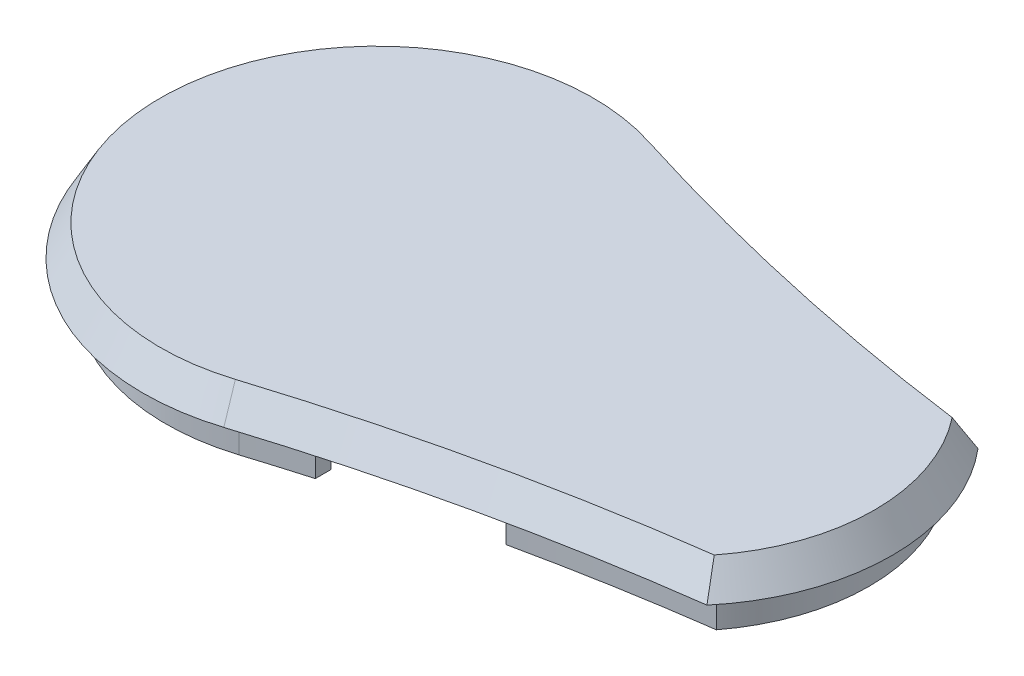
ISO-10303-21;
HEADER;
FILE_DESCRIPTION(('STEP AP214'),'2;1');
FILE_NAME('part.step','',(''),(''),'','','');
FILE_SCHEMA(('AUTOMOTIVE_DESIGN { 1 0 10303 214 1 1 1 1 }'));
ENDSEC;
DATA;
#1=APPLICATION_CONTEXT('core data for automotive mechanical design processes');
#2=APPLICATION_PROTOCOL_DEFINITION('international standard','automotive_design',2000,#1);
#3=PRODUCT_CONTEXT('',#1,'mechanical');
#4=PRODUCT('Part','Part','',(#3));
#5=PRODUCT_RELATED_PRODUCT_CATEGORY('part','',(#4));
#6=PRODUCT_DEFINITION_FORMATION('','',#4);
#7=PRODUCT_DEFINITION_CONTEXT('part definition',#1,'design');
#8=PRODUCT_DEFINITION('design','',#6,#7);
#9=PRODUCT_DEFINITION_SHAPE('','',#8);
#10=(LENGTH_UNIT() NAMED_UNIT(*) SI_UNIT(.MILLI.,.METRE.));
#11=(NAMED_UNIT(*) PLANE_ANGLE_UNIT() SI_UNIT($,.RADIAN.));
#12=(NAMED_UNIT(*) SI_UNIT($,.STERADIAN.) SOLID_ANGLE_UNIT());
#13=UNCERTAINTY_MEASURE_WITH_UNIT(LENGTH_MEASURE(1.E-05),#10,'distance_accuracy_value','');
#14=(GEOMETRIC_REPRESENTATION_CONTEXT(3) GLOBAL_UNCERTAINTY_ASSIGNED_CONTEXT((#13)) GLOBAL_UNIT_ASSIGNED_CONTEXT((#10,
#11,#12)) REPRESENTATION_CONTEXT('',''));
#15=CARTESIAN_POINT('',(0.,0.,0.));
#16=DIRECTION('',(0.,0.,1.));
#17=DIRECTION('',(1.,0.,0.));
#18=AXIS2_PLACEMENT_3D('',#15,#16,#17);
#19=CARTESIAN_POINT('',(101.133333333333,-5.,321.467026130035));
#20=DIRECTION('',(0.,-1.,0.));
#21=DIRECTION('',(0.,0.,-1.));
#22=AXIS2_PLACEMENT_3D('',#19,#20,#21);
#23=PLANE('',#22);
#24=DIRECTION('',(0.,0.,-1.));
#25=VECTOR('',#24,1.);
#26=CARTESIAN_POINT('',(16.,-5.,32.5));
#27=LINE('',#26,#25);
#28=CARTESIAN_POINT('',(16.,-5.,24.0611321344608));
#29=VERTEX_POINT('',#28);
#30=CARTESIAN_POINT('',(16.,-5.,21.9813516894183));
#31=VERTEX_POINT('',#30);
#32=EDGE_CURVE('E47',#29,#31,#27,.T.);
#33=ORIENTED_EDGE('',*,*,#32,.F.);
#34=CARTESIAN_POINT('',(101.133333333333,-5.,321.467026130035));
#35=DIRECTION('',(0.,1.,0.));
#36=DIRECTION('',(0.,0.,-1.));
#37=AXIS2_PLACEMENT_3D('',#34,#35,#36);
#38=CIRCLE('',#37,309.350852961086);
#39=CARTESIAN_POINT('',(8.29747894323103,-5.,26.3747450256135));
#40=VERTEX_POINT('',#39);
#41=EDGE_CURVE('E226',#29,#40,#38,.T.);
#42=ORIENTED_EDGE('',*,*,#41,.T.);
#43=CARTESIAN_POINT('',(0.,-5.,0.));
#44=DIRECTION('',(0.,-1.,0.));
#45=DIRECTION('',(0.,0.,-1.));
#46=AXIS2_PLACEMENT_3D('',#43,#44,#45);
#47=CIRCLE('',#46,27.649147038914);
#48=CARTESIAN_POINT('',(8.29747894323073,-5.,-26.3747450256136));
#49=VERTEX_POINT('',#48);
#50=EDGE_CURVE('E237',#40,#49,#47,.T.);
#51=ORIENTED_EDGE('',*,*,#50,.T.);
#52=CARTESIAN_POINT('',(101.133333333333,-5.,-321.467026130035));
#53=DIRECTION('',(0.,1.,0.));
#54=DIRECTION('',(0.,0.,-1.));
#55=AXIS2_PLACEMENT_3D('',#52,#53,#54);
#56=CIRCLE('',#55,309.350852961086);
#57=CARTESIAN_POINT('',(16.,-5.,-24.0611321344607));
#58=VERTEX_POINT('',#57);
#59=EDGE_CURVE('E240',#49,#58,#56,.T.);
#60=ORIENTED_EDGE('',*,*,#59,.T.);
#61=CARTESIAN_POINT('',(16.,-5.,-21.9813516894182));
#62=VERTEX_POINT('',#61);
#63=EDGE_CURVE('E231',#62,#58,#27,.T.);
#64=ORIENTED_EDGE('',*,*,#63,.F.);
#65=CARTESIAN_POINT('',(101.133333333333,-5.,-321.467026130035));
#66=DIRECTION('',(0.,1.,0.));
#67=DIRECTION('',(0.,0.,-1.));
#68=AXIS2_PLACEMENT_3D('',#65,#66,#67);
#69=CIRCLE('',#68,311.350852961086);
#70=CARTESIAN_POINT('',(7.6972811192941,-5.,-24.4669288468002));
#71=VERTEX_POINT('',#70);
#72=EDGE_CURVE('E426',#71,#62,#69,.T.);
#73=ORIENTED_EDGE('',*,*,#72,.F.);
#74=CARTESIAN_POINT('',(0.,-5.,0.));
#75=DIRECTION('',(0.,-1.,0.));
#76=DIRECTION('',(0.,0.,-1.));
#77=AXIS2_PLACEMENT_3D('',#74,#75,#76);
#78=CIRCLE('',#77,25.649147038914);
#79=CARTESIAN_POINT('',(7.69728111929433,-5.,24.4669288468002));
#80=VERTEX_POINT('',#79);
#81=EDGE_CURVE('E424',#80,#71,#78,.T.);
#82=ORIENTED_EDGE('',*,*,#81,.F.);
#83=CARTESIAN_POINT('',(101.133333333333,-5.,321.467026130035));
#84=DIRECTION('',(0.,1.,0.));
#85=DIRECTION('',(0.,0.,-1.));
#86=AXIS2_PLACEMENT_3D('',#83,#84,#85);
#87=CIRCLE('',#86,311.350852961086);
#88=EDGE_CURVE('E229',#31,#80,#87,.T.);
#89=ORIENTED_EDGE('',*,*,#88,.F.);
#90=EDGE_LOOP('',(#33,#42,#51,#60,#64,#73,#82,#89));
#91=FACE_BOUND('',#90,.T.);
#92=ADVANCED_FACE('F32',(#91),#23,.T.);
#93=CARTESIAN_POINT('',(70.5666666666667,0.,-160.733513065018));
#94=DIRECTION('',(0.,1.,0.));
#95=DIRECTION('',(0.,0.,1.));
#96=AXIS2_PLACEMENT_3D('',#93,#94,#95);
#97=PLANE('',#96);
#98=DIRECTION('',(0.,0.,-1.));
#99=VECTOR('',#98,1.);
#100=CARTESIAN_POINT('',(16.,0.,32.5));
#101=LINE('',#100,#99);
#102=CARTESIAN_POINT('',(16.,0.,-21.9813516894182));
#103=VERTEX_POINT('',#102);
#104=CARTESIAN_POINT('',(16.,0.,-24.0611321344607));
#105=VERTEX_POINT('',#104);
#106=EDGE_CURVE('E355',#103,#105,#101,.T.);
#107=ORIENTED_EDGE('',*,*,#106,.T.);
#108=CARTESIAN_POINT('',(101.133333333333,0.,-321.467026130035));
#109=DIRECTION('',(0.,1.,0.));
#110=DIRECTION('',(0.,0.,-1.));
#111=AXIS2_PLACEMENT_3D('',#108,#109,#110);
#112=CIRCLE('',#111,309.350852961086);
#113=CARTESIAN_POINT('',(8.29747894323073,0.,-26.3747450256136));
#114=VERTEX_POINT('',#113);
#115=EDGE_CURVE('E264',#114,#105,#112,.T.);
#116=ORIENTED_EDGE('',*,*,#115,.F.);
#117=CARTESIAN_POINT('',(0.,0.,0.));
#118=DIRECTION('',(0.,-1.,0.));
#119=DIRECTION('',(0.,0.,-1.));
#120=AXIS2_PLACEMENT_3D('',#117,#118,#119);
#121=CIRCLE('',#120,27.649147038914);
#122=CARTESIAN_POINT('',(8.29747894323103,0.,26.3747450256135));
#123=VERTEX_POINT('',#122);
#124=EDGE_CURVE('E261',#123,#114,#121,.T.);
#125=ORIENTED_EDGE('',*,*,#124,.F.);
#126=CARTESIAN_POINT('',(101.133333333333,0.,321.467026130035));
#127=DIRECTION('',(0.,1.,0.));
#128=DIRECTION('',(0.,0.,-1.));
#129=AXIS2_PLACEMENT_3D('',#126,#127,#128);
#130=CIRCLE('',#129,309.350852961086);
#131=CARTESIAN_POINT('',(16.,0.,24.0611321344608));
#132=VERTEX_POINT('',#131);
#133=EDGE_CURVE('E259',#132,#123,#130,.T.);
#134=ORIENTED_EDGE('',*,*,#133,.F.);
#135=CARTESIAN_POINT('',(16.,0.,21.9813516894183));
#136=VERTEX_POINT('',#135);
#137=EDGE_CURVE('E217',#132,#136,#101,.T.);
#138=ORIENTED_EDGE('',*,*,#137,.T.);
#139=CARTESIAN_POINT('',(101.133333333333,0.,321.467026130035));
#140=DIRECTION('',(0.,1.,0.));
#141=DIRECTION('',(0.,0.,1.));
#142=AXIS2_PLACEMENT_3D('',#139,#140,#141);
#143=CIRCLE('',#142,311.350852961086);
#144=CARTESIAN_POINT('',(23.3066939615326,0.,20.));
#145=VERTEX_POINT('',#144);
#146=EDGE_CURVE('E686',#136,#145,#143,.F.);
#147=ORIENTED_EDGE('',*,*,#146,.T.);
#148=DIRECTION('',(1.,0.,0.));
#149=VECTOR('',#148,1.);
#150=CARTESIAN_POINT('',(23.3066939615326,0.,20.));
#151=LINE('',#150,#149);
#152=CARTESIAN_POINT('',(27.8689571226325,0.,20.));
#153=VERTEX_POINT('',#152);
#154=EDGE_CURVE('E685',#145,#153,#151,.T.);
#155=ORIENTED_EDGE('',*,*,#154,.T.);
#156=CARTESIAN_POINT('',(27.8689571226325,0.,17.));
#157=DIRECTION('',(0.,1.,0.));
#158=DIRECTION('',(0.,0.,1.));
#159=AXIS2_PLACEMENT_3D('',#156,#157,#158);
#160=CIRCLE('',#159,3.);
#161=CARTESIAN_POINT('',(29.9902774661921,0.,19.1213203435596));
#162=VERTEX_POINT('',#161);
#163=EDGE_CURVE('E690',#153,#162,#160,.T.);
#164=ORIENTED_EDGE('',*,*,#163,.T.);
#165=DIRECTION('',(0.707106781186568,0.,-0.707106781186527));
#166=VECTOR('',#165,1.);
#167=CARTESIAN_POINT('',(29.9902774661921,0.,19.1213203435596));
#168=LINE('',#167,#166);
#169=CARTESIAN_POINT('',(30.9917528563012,0.,18.1198449534506));
#170=VERTEX_POINT('',#169);
#171=EDGE_CURVE('E697',#162,#170,#168,.T.);
#172=ORIENTED_EDGE('',*,*,#171,.T.);
#173=CARTESIAN_POINT('',(101.133333333333,0.,321.467026130035));
#174=DIRECTION('',(0.,1.,0.));
#175=DIRECTION('',(0.,0.,1.));
#176=AXIS2_PLACEMENT_3D('',#173,#174,#175);
#177=CIRCLE('',#176,311.350852961086);
#178=CARTESIAN_POINT('',(36.,0.,17.0052017111361));
#179=VERTEX_POINT('',#178);
#180=EDGE_CURVE('E699',#170,#179,#177,.F.);
#181=ORIENTED_EDGE('',*,*,#180,.T.);
#182=DIRECTION('',(0.,0.,1.));
#183=VECTOR('',#182,1.);
#184=CARTESIAN_POINT('',(36.,0.,32.5));
#185=LINE('',#184,#183);
#186=CARTESIAN_POINT('',(36.,0.,19.0507581869231));
#187=VERTEX_POINT('',#186);
#188=EDGE_CURVE('E702',#179,#187,#185,.T.);
#189=ORIENTED_EDGE('',*,*,#188,.T.);
#190=CARTESIAN_POINT('',(101.133333333333,0.,321.467026130035));
#191=DIRECTION('',(0.,1.,0.));
#192=DIRECTION('',(0.,0.,-1.));
#193=AXIS2_PLACEMENT_3D('',#190,#191,#192);
#194=CIRCLE('',#193,309.350852961086);
#195=CARTESIAN_POINT('',(59.4237727680008,0.,14.940905244395));
#196=VERTEX_POINT('',#195);
#197=EDGE_CURVE('E238',#196,#187,#194,.T.);
#198=ORIENTED_EDGE('',*,*,#197,.F.);
#199=CARTESIAN_POINT('',(40.,0.,0.));
#200=DIRECTION('',(0.,-1.,0.));
#201=DIRECTION('',(0.,0.,-1.));
#202=AXIS2_PLACEMENT_3D('',#199,#200,#201);
#203=CIRCLE('',#202,24.5053789618712);
#204=CARTESIAN_POINT('',(59.423772768001,0.,-14.9409052443948));
#205=VERTEX_POINT('',#204);
#206=EDGE_CURVE('E243',#205,#196,#203,.T.);
#207=ORIENTED_EDGE('',*,*,#206,.F.);
#208=CARTESIAN_POINT('',(101.133333333333,0.,-321.467026130035));
#209=DIRECTION('',(0.,1.,0.));
#210=DIRECTION('',(0.,0.,-1.));
#211=AXIS2_PLACEMENT_3D('',#208,#209,#210);
#212=CIRCLE('',#211,309.350852961086);
#213=CARTESIAN_POINT('',(36.,0.,-19.0507581869231));
#214=VERTEX_POINT('',#213);
#215=EDGE_CURVE('E267',#214,#205,#212,.T.);
#216=ORIENTED_EDGE('',*,*,#215,.F.);
#217=CARTESIAN_POINT('',(36.,0.,-17.0052017111361));
#218=VERTEX_POINT('',#217);
#219=EDGE_CURVE('E704',#214,#218,#185,.T.);
#220=ORIENTED_EDGE('',*,*,#219,.T.);
#221=CARTESIAN_POINT('',(101.133333333333,0.,-321.467026130035));
#222=DIRECTION('',(0.,1.,0.));
#223=DIRECTION('',(0.,0.,1.));
#224=AXIS2_PLACEMENT_3D('',#221,#222,#223);
#225=CIRCLE('',#224,311.350852961086);
#226=CARTESIAN_POINT('',(30.9917528563011,0.,-18.1198449534506));
#227=VERTEX_POINT('',#226);
#228=EDGE_CURVE('E688',#218,#227,#225,.F.);
#229=ORIENTED_EDGE('',*,*,#228,.T.);
#230=DIRECTION('',(-0.707106781186508,0.,-0.707106781186587));
#231=VECTOR('',#230,1.);
#232=CARTESIAN_POINT('',(30.9917528563011,0.,-18.1198449534506));
#233=LINE('',#232,#231);
#234=CARTESIAN_POINT('',(29.9902774661921,0.,-19.1213203435596));
#235=VERTEX_POINT('',#234);
#236=EDGE_CURVE('E692',#227,#235,#233,.T.);
#237=ORIENTED_EDGE('',*,*,#236,.T.);
#238=CARTESIAN_POINT('',(27.8689571226325,0.,-17.));
#239=DIRECTION('',(0.,1.,0.));
#240=DIRECTION('',(0.,0.,1.));
#241=AXIS2_PLACEMENT_3D('',#238,#239,#240);
#242=CIRCLE('',#241,3.);
#243=CARTESIAN_POINT('',(27.8689571226325,0.,-20.));
#244=VERTEX_POINT('',#243);
#245=EDGE_CURVE('E55',#235,#244,#242,.T.);
#246=ORIENTED_EDGE('',*,*,#245,.T.);
#247=DIRECTION('',(-1.,0.,0.));
#248=VECTOR('',#247,1.);
#249=CARTESIAN_POINT('',(27.8689571226325,0.,-20.));
#250=LINE('',#249,#248);
#251=CARTESIAN_POINT('',(23.3066939615324,0.,-20.));
#252=VERTEX_POINT('',#251);
#253=EDGE_CURVE('E292',#244,#252,#250,.T.);
#254=ORIENTED_EDGE('',*,*,#253,.T.);
#255=CARTESIAN_POINT('',(101.133333333333,0.,-321.467026130035));
#256=DIRECTION('',(0.,1.,0.));
#257=DIRECTION('',(0.,0.,1.));
#258=AXIS2_PLACEMENT_3D('',#255,#256,#257);
#259=CIRCLE('',#258,311.350852961086);
#260=EDGE_CURVE('E707',#252,#103,#259,.F.);
#261=ORIENTED_EDGE('',*,*,#260,.T.);
#262=EDGE_LOOP('',(#107,#116,#125,#134,#138,#147,#155,#164,#172,#181,#189,#198,#207,#216,#220,
#229,#237,#246,#254,#261));
#263=FACE_BOUND('',#262,.T.);
#264=CARTESIAN_POINT('',(40.,0.,0.));
#265=DIRECTION('',(0.,1.,0.));
#266=DIRECTION('',(0.,0.,1.));
#267=AXIS2_PLACEMENT_3D('',#264,#265,#266);
#268=CIRCLE('',#267,27.505378961871);
#269=CARTESIAN_POINT('',(61.0068895309128,0.,17.755462936014));
#270=VERTEX_POINT('',#269);
#271=CARTESIAN_POINT('',(61.0068895309128,0.,-17.755462936014));
#272=VERTEX_POINT('',#271);
#273=EDGE_CURVE('E286',#270,#272,#268,.T.);
#274=ORIENTED_EDGE('',*,*,#273,.F.);
#275=CARTESIAN_POINT('',(101.133333333333,0.,321.467026130035));
#276=DIRECTION('',(0.,-1.,0.));
#277=DIRECTION('',(0.,0.,1.));
#278=AXIS2_PLACEMENT_3D('',#275,#276,#277);
#279=CIRCLE('',#278,306.350852961086);
#280=CARTESIAN_POINT('',(9.19777567913612,0.,29.2364692938334));
#281=VERTEX_POINT('',#280);
#282=EDGE_CURVE('E284',#281,#270,#279,.T.);
#283=ORIENTED_EDGE('',*,*,#282,.F.);
#284=CARTESIAN_POINT('',(0.,0.,0.));
#285=DIRECTION('',(0.,1.,0.));
#286=DIRECTION('',(0.,0.,1.));
#287=AXIS2_PLACEMENT_3D('',#284,#285,#286);
#288=CIRCLE('',#287,30.649147038914);
#289=CARTESIAN_POINT('',(9.19777567913601,0.,-29.2364692938335));
#290=VERTEX_POINT('',#289);
#291=EDGE_CURVE('E282',#290,#281,#288,.T.);
#292=ORIENTED_EDGE('',*,*,#291,.F.);
#293=CARTESIAN_POINT('',(101.133333333333,0.,-321.467026130035));
#294=DIRECTION('',(0.,-1.,0.));
#295=DIRECTION('',(0.,0.,1.));
#296=AXIS2_PLACEMENT_3D('',#293,#294,#295);
#297=CIRCLE('',#296,306.350852961086);
#298=EDGE_CURVE('E280',#272,#290,#297,.T.);
#299=ORIENTED_EDGE('',*,*,#298,.F.);
#300=EDGE_LOOP('',(#274,#283,#292,#299));
#301=FACE_BOUND('',#300,.T.);
#302=ADVANCED_FACE('F328',(#263,#301),#97,.F.);
#303=CARTESIAN_POINT('',(101.133333333333,0.,-321.467026130035));
#304=DIRECTION('',(0.,1.,0.));
#305=DIRECTION('',(0.,0.,1.));
#306=AXIS2_PLACEMENT_3D('',#303,#304,#305);
#307=CONICAL_SURFACE('',#306,306.350852961086,0.5235987755983);
#308=ORIENTED_EDGE('',*,*,#298,.T.);
#309=DIRECTION('',(0.150049455984174,-0.866025403784438,-0.476954044703318));
#310=VECTOR('',#309,1.);
#311=CARTESIAN_POINT('',(9.197775679136,0.,-29.2364692938335));
#312=LINE('',#311,#310);
#313=CARTESIAN_POINT('',(8.50472692870224,4.,-27.0335129250291));
#314=VERTEX_POINT('',#313);
#315=EDGE_CURVE('E289',#314,#290,#312,.T.);
#316=ORIENTED_EDGE('',*,*,#315,.F.);
#317=CARTESIAN_POINT('',(101.133333333333,4.,-321.467026130035));
#318=DIRECTION('',(0.,1.,0.));
#319=DIRECTION('',(0.,0.,1.));
#320=AXIS2_PLACEMENT_3D('',#317,#318,#319);
#321=CIRCLE('',#320,308.660254037844);
#322=CARTESIAN_POINT('',(59.7957246323996,4.,-15.5873855365576));
#323=VERTEX_POINT('',#322);
#324=EDGE_CURVE('E288',#323,#314,#321,.F.);
#325=ORIENTED_EDGE('',*,*,#324,.F.);
#326=CARTESIAN_POINT('',(59.7957246323996,4.,-15.5873855365576));
#327=CARTESIAN_POINT('',(59.8986271619901,3.66696589832843,-15.767504195531));
#328=CARTESIAN_POINT('',(60.0010149966196,3.33385177066652,-15.9477687176377));
#329=CARTESIAN_POINT('',(60.2047935761917,2.66747314652459,-16.3085775395495));
#330=CARTESIAN_POINT('',(60.3061843277656,2.33420865106005,-16.4891218374847));
#331=CARTESIAN_POINT('',(60.5080023443883,1.66753475904859,-16.8504805422827));
#332=CARTESIAN_POINT('',(60.6084296100658,1.33412536259638,-17.0312949489692));
#333=CARTESIAN_POINT('',(60.8083515994204,0.667165931540273,-17.3931854304988));
#334=CARTESIAN_POINT('',(60.907846316887,0.333615896015199,-17.5742615070753));
#335=CARTESIAN_POINT('',(61.0068895309128,0.,-17.755462936014));
#336=B_SPLINE_CURVE_WITH_KNOTS('',3,(#326,#327,#328,#329,#330,#331,#332,#333,#334,#335),
.UNSPECIFIED.,.F.,.F.,(4,2,2,2,4),(0.,1.17706803318524,2.35412823278435,3.53118766411995,
4.70825492873395),.UNSPECIFIED.);
#337=EDGE_CURVE('E294',#323,#272,#336,.T.);
#338=ORIENTED_EDGE('',*,*,#337,.T.);
#339=EDGE_LOOP('',(#308,#316,#325,#338));
#340=FACE_BOUND('',#339,.T.);
#341=ADVANCED_FACE('F310',(#340),#307,.F.);
#342=CARTESIAN_POINT('',(0.,0.,0.));
#343=DIRECTION('',(0.,-1.,0.));
#344=DIRECTION('',(0.,0.,1.));
#345=AXIS2_PLACEMENT_3D('',#342,#343,#344);
#346=CONICAL_SURFACE('',#345,30.649147038914,0.5235987755983);
#347=ORIENTED_EDGE('',*,*,#291,.T.);
#348=DIRECTION('',(0.150049455984174,-0.866025403784438,0.476954044703318));
#349=VECTOR('',#348,1.);
#350=CARTESIAN_POINT('',(9.19777567913624,0.,29.2364692938334));
#351=LINE('',#350,#349);
#352=CARTESIAN_POINT('',(8.50472692870248,4.,27.0335129250291));
#353=VERTEX_POINT('',#352);
#354=EDGE_CURVE('E293',#353,#281,#351,.T.);
#355=ORIENTED_EDGE('',*,*,#354,.F.);
#356=CARTESIAN_POINT('',(0.,4.,0.));
#357=DIRECTION('',(0.,1.,0.));
#358=DIRECTION('',(0.,0.,1.));
#359=AXIS2_PLACEMENT_3D('',#356,#357,#358);
#360=CIRCLE('',#359,28.3397459621555);
#361=EDGE_CURVE('E473',#314,#353,#360,.T.);
#362=ORIENTED_EDGE('',*,*,#361,.F.);
#363=ORIENTED_EDGE('',*,*,#315,.T.);
#364=EDGE_LOOP('',(#347,#355,#362,#363));
#365=FACE_BOUND('',#364,.T.);
#366=ADVANCED_FACE('F34',(#365),#346,.T.);
#367=CARTESIAN_POINT('',(101.133333333333,0.,321.467026130035));
#368=DIRECTION('',(0.,1.,0.));
#369=DIRECTION('',(0.,0.,1.));
#370=AXIS2_PLACEMENT_3D('',#367,#368,#369);
#371=CONICAL_SURFACE('',#370,306.350852961086,0.5235987755983);
#372=ORIENTED_EDGE('',*,*,#282,.T.);
#373=CARTESIAN_POINT('',(59.7957246323997,4.,15.5873855365576));
#374=CARTESIAN_POINT('',(59.89862716199,3.66696589832844,15.7675041955311));
#375=CARTESIAN_POINT('',(60.0010149966195,3.33385177066653,15.9477687176378));
#376=CARTESIAN_POINT('',(60.2047935761917,2.6674731465246,16.3085775395496));
#377=CARTESIAN_POINT('',(60.3061843277656,2.33420865106005,16.4891218374847));
#378=CARTESIAN_POINT('',(60.5080023443883,1.66753475904858,16.8504805422827));
#379=CARTESIAN_POINT('',(60.6084296100658,1.33412536259637,17.0312949489692));
#380=CARTESIAN_POINT('',(60.8083515994203,0.667165931540267,17.3931854304988));
#381=CARTESIAN_POINT('',(60.9078463168869,0.333615896015193,17.5742615070753));
#382=CARTESIAN_POINT('',(61.0068895309128,0.,17.755462936014));
#383=B_SPLINE_CURVE_WITH_KNOTS('',3,(#373,#374,#375,#376,#377,#378,#379,#380,#381,#382),
.UNSPECIFIED.,.F.,.F.,(4,2,2,2,4),(0.,1.17706803318525,2.35412823278437,3.53118766411997,
4.70825492873397),.UNSPECIFIED.);
#384=CARTESIAN_POINT('',(59.7957246323997,4.,15.5873855365576));
#385=VERTEX_POINT('',#384);
#386=EDGE_CURVE('E303',#385,#270,#383,.T.);
#387=ORIENTED_EDGE('',*,*,#386,.F.);
#388=CARTESIAN_POINT('',(101.133333333333,4.,321.467026130035));
#389=DIRECTION('',(0.,1.,0.));
#390=DIRECTION('',(0.,0.,1.));
#391=AXIS2_PLACEMENT_3D('',#388,#389,#390);
#392=CIRCLE('',#391,308.660254037845);
#393=EDGE_CURVE('E471',#353,#385,#392,.F.);
#394=ORIENTED_EDGE('',*,*,#393,.F.);
#395=ORIENTED_EDGE('',*,*,#354,.T.);
#396=EDGE_LOOP('',(#372,#387,#394,#395));
#397=FACE_BOUND('',#396,.T.);
#398=ADVANCED_FACE('F317',(#397),#371,.F.);
#399=CARTESIAN_POINT('',(40.,0.,0.));
#400=DIRECTION('',(0.,-1.,0.));
#401=DIRECTION('',(0.,0.,1.));
#402=AXIS2_PLACEMENT_3D('',#399,#400,#401);
#403=CONICAL_SURFACE('',#402,27.505378961871,0.5235987755983);
#404=ORIENTED_EDGE('',*,*,#273,.T.);
#405=ORIENTED_EDGE('',*,*,#337,.F.);
#406=CARTESIAN_POINT('',(40.,4.,0.));
#407=DIRECTION('',(0.,1.,0.));
#408=DIRECTION('',(0.,0.,1.));
#409=AXIS2_PLACEMENT_3D('',#406,#407,#408);
#410=CIRCLE('',#409,25.1959778851125);
#411=EDGE_CURVE('E304',#385,#323,#410,.T.);
#412=ORIENTED_EDGE('',*,*,#411,.F.);
#413=ORIENTED_EDGE('',*,*,#386,.T.);
#414=EDGE_LOOP('',(#404,#405,#412,#413));
#415=FACE_BOUND('',#414,.T.);
#416=ADVANCED_FACE('F313',(#415),#403,.T.);
#417=CARTESIAN_POINT('',(70.5666666666667,4.,-160.733513065018));
#418=DIRECTION('',(0.,1.,0.));
#419=DIRECTION('',(0.,0.,1.));
#420=AXIS2_PLACEMENT_3D('',#417,#418,#419);
#421=PLANE('',#420);
#422=ORIENTED_EDGE('',*,*,#324,.T.);
#423=ORIENTED_EDGE('',*,*,#361,.T.);
#424=ORIENTED_EDGE('',*,*,#393,.T.);
#425=ORIENTED_EDGE('',*,*,#411,.T.);
#426=EDGE_LOOP('',(#422,#423,#424,#425));
#427=FACE_BOUND('',#426,.T.);
#428=ADVANCED_FACE('F316',(#427),#421,.T.);
#429=DIRECTION('',(0.,0.,1.));
#430=VECTOR('',#429,1.);
#431=CARTESIAN_POINT('',(36.,-5.,32.5));
#432=LINE('',#431,#430);
#433=CARTESIAN_POINT('',(36.,-5.,-19.0507581869231));
#434=VERTEX_POINT('',#433);
#435=CARTESIAN_POINT('',(36.,-5.,-17.0052017111361));
#436=VERTEX_POINT('',#435);
#437=EDGE_CURVE('E348',#434,#436,#432,.T.);
#438=ORIENTED_EDGE('',*,*,#437,.F.);
#439=CARTESIAN_POINT('',(101.133333333333,-5.,-321.467026130035));
#440=DIRECTION('',(0.,1.,0.));
#441=DIRECTION('',(0.,0.,-1.));
#442=AXIS2_PLACEMENT_3D('',#439,#440,#441);
#443=CIRCLE('',#442,309.350852961086);
#444=CARTESIAN_POINT('',(59.4237727680011,-5.,-14.9409052443949));
#445=VERTEX_POINT('',#444);
#446=EDGE_CURVE('E251',#434,#445,#443,.T.);
#447=ORIENTED_EDGE('',*,*,#446,.T.);
#448=CARTESIAN_POINT('',(40.,-5.,0.));
#449=DIRECTION('',(0.,-1.,0.));
#450=DIRECTION('',(0.,0.,-1.));
#451=AXIS2_PLACEMENT_3D('',#448,#449,#450);
#452=CIRCLE('',#451,24.5053789618712);
#453=CARTESIAN_POINT('',(59.4237727680008,-5.,14.940905244395));
#454=VERTEX_POINT('',#453);
#455=EDGE_CURVE('E253',#445,#454,#452,.T.);
#456=ORIENTED_EDGE('',*,*,#455,.T.);
#457=CARTESIAN_POINT('',(101.133333333333,-5.,321.467026130035));
#458=DIRECTION('',(0.,1.,0.));
#459=DIRECTION('',(0.,0.,-1.));
#460=AXIS2_PLACEMENT_3D('',#457,#458,#459);
#461=CIRCLE('',#460,309.350852961086);
#462=CARTESIAN_POINT('',(36.,-5.,19.0507581869231));
#463=VERTEX_POINT('',#462);
#464=EDGE_CURVE('E255',#454,#463,#461,.T.);
#465=ORIENTED_EDGE('',*,*,#464,.T.);
#466=CARTESIAN_POINT('',(36.,-5.,17.0052017111361));
#467=VERTEX_POINT('',#466);
#468=EDGE_CURVE('E230',#467,#463,#432,.T.);
#469=ORIENTED_EDGE('',*,*,#468,.F.);
#470=CARTESIAN_POINT('',(101.133333333333,-5.,321.467026130035));
#471=DIRECTION('',(0.,1.,0.));
#472=DIRECTION('',(0.,0.,-1.));
#473=AXIS2_PLACEMENT_3D('',#470,#471,#472);
#474=CIRCLE('',#473,311.350852961086);
#475=CARTESIAN_POINT('',(58.3183343717941,-5.,13.0740471186462));
#476=VERTEX_POINT('',#475);
#477=EDGE_CURVE('E421',#476,#467,#474,.T.);
#478=ORIENTED_EDGE('',*,*,#477,.F.);
#479=CARTESIAN_POINT('',(40.,-5.,0.));
#480=DIRECTION('',(0.,-1.,0.));
#481=DIRECTION('',(0.,0.,-1.));
#482=AXIS2_PLACEMENT_3D('',#479,#480,#481);
#483=CIRCLE('',#482,22.5053789618713);
#484=CARTESIAN_POINT('',(58.3183343717943,-5.,-13.0740471186461));
#485=VERTEX_POINT('',#484);
#486=EDGE_CURVE('E419',#485,#476,#483,.T.);
#487=ORIENTED_EDGE('',*,*,#486,.F.);
#488=CARTESIAN_POINT('',(101.133333333333,-5.,-321.467026130035));
#489=DIRECTION('',(0.,1.,0.));
#490=DIRECTION('',(0.,0.,-1.));
#491=AXIS2_PLACEMENT_3D('',#488,#489,#490);
#492=CIRCLE('',#491,311.350852961086);
#493=EDGE_CURVE('E352',#436,#485,#492,.T.);
#494=ORIENTED_EDGE('',*,*,#493,.F.);
#495=EDGE_LOOP('',(#438,#447,#456,#465,#469,#478,#487,#494));
#496=FACE_BOUND('',#495,.T.);
#497=ADVANCED_FACE('F330',(#496),#23,.T.);
#498=CARTESIAN_POINT('',(101.133333333333,-5.,321.467026130035));
#499=DIRECTION('',(0.,1.,0.));
#500=DIRECTION('',(0.,0.,1.));
#501=AXIS2_PLACEMENT_3D('',#498,#499,#500);
#502=CYLINDRICAL_SURFACE('',#501,309.350852961086);
#503=ORIENTED_EDGE('',*,*,#41,.F.);
#504=DIRECTION('',(0.,1.,0.));
#505=VECTOR('',#504,1.);
#506=CARTESIAN_POINT('',(16.,-5.,24.0611321344608));
#507=LINE('',#506,#505);
#508=EDGE_CURVE('E214',#29,#132,#507,.T.);
#509=ORIENTED_EDGE('',*,*,#508,.T.);
#510=ORIENTED_EDGE('',*,*,#133,.T.);
#511=DIRECTION('',(0.,1.,0.));
#512=VECTOR('',#511,1.);
#513=CARTESIAN_POINT('',(8.29747894323103,-5.,26.3747450256135));
#514=LINE('',#513,#512);
#515=EDGE_CURVE('E236',#40,#123,#514,.T.);
#516=ORIENTED_EDGE('',*,*,#515,.F.);
#517=EDGE_LOOP('',(#503,#509,#510,#516));
#518=FACE_BOUND('',#517,.T.);
#519=ADVANCED_FACE('F234',(#518),#502,.F.);
#520=CARTESIAN_POINT('',(0.,-5.,0.));
#521=DIRECTION('',(0.,1.,0.));
#522=DIRECTION('',(0.,0.,1.));
#523=AXIS2_PLACEMENT_3D('',#520,#521,#522);
#524=CYLINDRICAL_SURFACE('',#523,27.649147038914);
#525=ORIENTED_EDGE('',*,*,#124,.T.);
#526=DIRECTION('',(0.,1.,0.));
#527=VECTOR('',#526,1.);
#528=CARTESIAN_POINT('',(8.29747894323073,-5.,-26.3747450256136));
#529=LINE('',#528,#527);
#530=EDGE_CURVE('E276',#49,#114,#529,.T.);
#531=ORIENTED_EDGE('',*,*,#530,.F.);
#532=ORIENTED_EDGE('',*,*,#50,.F.);
#533=ORIENTED_EDGE('',*,*,#515,.T.);
#534=EDGE_LOOP('',(#525,#531,#532,#533));
#535=FACE_BOUND('',#534,.T.);
#536=ADVANCED_FACE('F342',(#535),#524,.T.);
#537=CARTESIAN_POINT('',(101.133333333333,-5.,-321.467026130035));
#538=DIRECTION('',(0.,1.,0.));
#539=DIRECTION('',(0.,0.,1.));
#540=AXIS2_PLACEMENT_3D('',#537,#538,#539);
#541=CYLINDRICAL_SURFACE('',#540,309.350852961086);
#542=ORIENTED_EDGE('',*,*,#115,.T.);
#543=DIRECTION('',(0.,1.,0.));
#544=VECTOR('',#543,1.);
#545=CARTESIAN_POINT('',(16.,-5.,-24.0611321344607));
#546=LINE('',#545,#544);
#547=EDGE_CURVE('E222',#105,#58,#546,.F.);
#548=ORIENTED_EDGE('',*,*,#547,.T.);
#549=ORIENTED_EDGE('',*,*,#59,.F.);
#550=ORIENTED_EDGE('',*,*,#530,.T.);
#551=EDGE_LOOP('',(#542,#548,#549,#550));
#552=FACE_BOUND('',#551,.T.);
#553=ADVANCED_FACE('F523',(#552),#541,.F.);
#554=CARTESIAN_POINT('',(101.133333333333,-5.,-321.467026130035));
#555=DIRECTION('',(0.,1.,0.));
#556=DIRECTION('',(0.,0.,1.));
#557=AXIS2_PLACEMENT_3D('',#554,#555,#556);
#558=CYLINDRICAL_SURFACE('',#557,309.350852961086);
#559=ORIENTED_EDGE('',*,*,#446,.F.);
#560=DIRECTION('',(0.,1.,0.));
#561=VECTOR('',#560,1.);
#562=CARTESIAN_POINT('',(36.,-5.,-19.0507581869231));
#563=LINE('',#562,#561);
#564=EDGE_CURVE('E360',#434,#214,#563,.T.);
#565=ORIENTED_EDGE('',*,*,#564,.T.);
#566=ORIENTED_EDGE('',*,*,#215,.T.);
#567=DIRECTION('',(0.,1.,0.));
#568=VECTOR('',#567,1.);
#569=CARTESIAN_POINT('',(59.4237727680011,-5.,-14.9409052443949));
#570=LINE('',#569,#568);
#571=EDGE_CURVE('E273',#445,#205,#570,.T.);
#572=ORIENTED_EDGE('',*,*,#571,.F.);
#573=EDGE_LOOP('',(#559,#565,#566,#572));
#574=FACE_BOUND('',#573,.T.);
#575=ADVANCED_FACE('F359',(#574),#558,.F.);
#576=CARTESIAN_POINT('',(40.,-5.,0.));
#577=DIRECTION('',(0.,1.,0.));
#578=DIRECTION('',(0.,0.,1.));
#579=AXIS2_PLACEMENT_3D('',#576,#577,#578);
#580=CYLINDRICAL_SURFACE('',#579,24.5053789618712);
#581=ORIENTED_EDGE('',*,*,#206,.T.);
#582=DIRECTION('',(0.,1.,0.));
#583=VECTOR('',#582,1.);
#584=CARTESIAN_POINT('',(59.4237727680008,-5.,14.940905244395));
#585=LINE('',#584,#583);
#586=EDGE_CURVE('E258',#454,#196,#585,.T.);
#587=ORIENTED_EDGE('',*,*,#586,.F.);
#588=ORIENTED_EDGE('',*,*,#455,.F.);
#589=ORIENTED_EDGE('',*,*,#571,.T.);
#590=EDGE_LOOP('',(#581,#587,#588,#589));
#591=FACE_BOUND('',#590,.T.);
#592=ADVANCED_FACE('F366',(#591),#580,.T.);
#593=CARTESIAN_POINT('',(101.133333333333,-5.,321.467026130035));
#594=DIRECTION('',(0.,1.,0.));
#595=DIRECTION('',(0.,0.,1.));
#596=AXIS2_PLACEMENT_3D('',#593,#594,#595);
#597=CYLINDRICAL_SURFACE('',#596,309.350852961086);
#598=ORIENTED_EDGE('',*,*,#197,.T.);
#599=DIRECTION('',(0.,1.,0.));
#600=VECTOR('',#599,1.);
#601=CARTESIAN_POINT('',(36.,-5.,19.0507581869231));
#602=LINE('',#601,#600);
#603=EDGE_CURVE('E374',#187,#463,#602,.F.);
#604=ORIENTED_EDGE('',*,*,#603,.T.);
#605=ORIENTED_EDGE('',*,*,#464,.F.);
#606=ORIENTED_EDGE('',*,*,#586,.T.);
#607=EDGE_LOOP('',(#598,#604,#605,#606));
#608=FACE_BOUND('',#607,.T.);
#609=ADVANCED_FACE('F373',(#608),#597,.F.);
#610=CARTESIAN_POINT('',(27.8689571226325,-5.,-17.));
#611=DIRECTION('',(0.,1.,0.));
#612=DIRECTION('',(0.,0.,1.));
#613=AXIS2_PLACEMENT_3D('',#610,#611,#612);
#614=CYLINDRICAL_SURFACE('',#613,3.);
#615=ORIENTED_EDGE('',*,*,#245,.F.);
#616=DIRECTION('',(0.,1.,0.));
#617=VECTOR('',#616,1.);
#618=CARTESIAN_POINT('',(29.9902774661921,-5.,-19.1213203435596));
#619=LINE('',#618,#617);
#620=CARTESIAN_POINT('',(29.9902774661921,2.,-19.1213203435596));
#621=VERTEX_POINT('',#620);
#622=EDGE_CURVE('E246',#235,#621,#619,.T.);
#623=ORIENTED_EDGE('',*,*,#622,.T.);
#624=CARTESIAN_POINT('',(27.8689571226325,2.,-17.));
#625=DIRECTION('',(0.,-1.,0.));
#626=DIRECTION('',(0.,0.,-1.));
#627=AXIS2_PLACEMENT_3D('',#624,#625,#626);
#628=CIRCLE('',#627,2.99999999999999);
#629=CARTESIAN_POINT('',(27.8689571226325,2.,-20.));
#630=VERTEX_POINT('',#629);
#631=EDGE_CURVE('E388',#630,#621,#628,.T.);
#632=ORIENTED_EDGE('',*,*,#631,.F.);
#633=DIRECTION('',(0.,1.,0.));
#634=VECTOR('',#633,1.);
#635=CARTESIAN_POINT('',(27.8689571226325,-5.,-20.));
#636=LINE('',#635,#634);
#637=EDGE_CURVE('E429',#244,#630,#636,.T.);
#638=ORIENTED_EDGE('',*,*,#637,.F.);
#639=EDGE_LOOP('',(#615,#623,#632,#638));
#640=FACE_BOUND('',#639,.T.);
#641=ADVANCED_FACE('F457',(#640),#614,.F.);
#642=CARTESIAN_POINT('',(30.9917528563011,-5.,-18.1198449534506));
#643=DIRECTION('',(-0.707106781186587,0.,0.707106781186508));
#644=DIRECTION('',(0.707106781186508,0.,0.707106781186587));
#645=AXIS2_PLACEMENT_3D('',#642,#643,#644);
#646=PLANE('',#645);
#647=ORIENTED_EDGE('',*,*,#236,.F.);
#648=DIRECTION('',(0.,1.,0.));
#649=VECTOR('',#648,1.);
#650=CARTESIAN_POINT('',(30.9917528563012,-5.,-18.1198449534506));
#651=LINE('',#650,#649);
#652=CARTESIAN_POINT('',(30.9917528563012,2.,-18.1198449534506));
#653=VERTEX_POINT('',#652);
#654=EDGE_CURVE('E448',#227,#653,#651,.T.);
#655=ORIENTED_EDGE('',*,*,#654,.T.);
#656=DIRECTION('',(0.707106781186549,0.,0.707106781186546));
#657=VECTOR('',#656,1.);
#658=CARTESIAN_POINT('',(29.9902774661921,2.,-19.1213203435596));
#659=LINE('',#658,#657);
#660=EDGE_CURVE('E391',#621,#653,#659,.T.);
#661=ORIENTED_EDGE('',*,*,#660,.F.);
#662=ORIENTED_EDGE('',*,*,#622,.F.);
#663=EDGE_LOOP('',(#647,#655,#661,#662));
#664=FACE_BOUND('',#663,.T.);
#665=ADVANCED_FACE('F459',(#664),#646,.T.);
#666=CARTESIAN_POINT('',(101.133333333333,-5.,-321.467026130035));
#667=DIRECTION('',(0.,1.,0.));
#668=DIRECTION('',(0.,0.,1.));
#669=AXIS2_PLACEMENT_3D('',#666,#667,#668);
#670=CYLINDRICAL_SURFACE('',#669,311.350852961086);
#671=ORIENTED_EDGE('',*,*,#228,.F.);
#672=DIRECTION('',(0.,1.,0.));
#673=VECTOR('',#672,1.);
#674=CARTESIAN_POINT('',(36.,-5.,-17.0052017111361));
#675=LINE('',#674,#673);
#676=EDGE_CURVE('E221',#436,#218,#675,.T.);
#677=ORIENTED_EDGE('',*,*,#676,.F.);
#678=ORIENTED_EDGE('',*,*,#493,.T.);
#679=DIRECTION('',(0.,1.,0.));
#680=VECTOR('',#679,1.);
#681=CARTESIAN_POINT('',(58.3183343717943,-5.,-13.0740471186461));
#682=LINE('',#681,#680);
#683=CARTESIAN_POINT('',(58.3183343717943,2.,-13.0740471186461));
#684=VERTEX_POINT('',#683);
#685=EDGE_CURVE('E447',#485,#684,#682,.T.);
#686=ORIENTED_EDGE('',*,*,#685,.T.);
#687=CARTESIAN_POINT('',(101.133333333333,2.,-321.467026130035));
#688=DIRECTION('',(0.,1.,0.));
#689=DIRECTION('',(0.,0.,-1.));
#690=AXIS2_PLACEMENT_3D('',#687,#688,#689);
#691=CIRCLE('',#690,311.350852961086);
#692=EDGE_CURVE('E394',#653,#684,#691,.T.);
#693=ORIENTED_EDGE('',*,*,#692,.F.);
#694=ORIENTED_EDGE('',*,*,#654,.F.);
#695=EDGE_LOOP('',(#671,#677,#678,#686,#693,#694));
#696=FACE_BOUND('',#695,.T.);
#697=ADVANCED_FACE('F550',(#696),#670,.T.);
#698=CARTESIAN_POINT('',(40.,-5.,0.));
#699=DIRECTION('',(0.,1.,0.));
#700=DIRECTION('',(0.,0.,1.));
#701=AXIS2_PLACEMENT_3D('',#698,#699,#700);
#702=CYLINDRICAL_SURFACE('',#701,22.5053789618713);
#703=DIRECTION('',(0.,1.,0.));
#704=VECTOR('',#703,1.);
#705=CARTESIAN_POINT('',(58.3183343717941,-5.,13.0740471186462));
#706=LINE('',#705,#704);
#707=CARTESIAN_POINT('',(58.3183343717942,2.,13.0740471186462));
#708=VERTEX_POINT('',#707);
#709=EDGE_CURVE('E445',#476,#708,#706,.T.);
#710=ORIENTED_EDGE('',*,*,#709,.T.);
#711=CARTESIAN_POINT('',(40.,2.,0.));
#712=DIRECTION('',(0.,-1.,0.));
#713=DIRECTION('',(0.,0.,-1.));
#714=AXIS2_PLACEMENT_3D('',#711,#712,#713);
#715=CIRCLE('',#714,22.5053789618712);
#716=EDGE_CURVE('E397',#684,#708,#715,.T.);
#717=ORIENTED_EDGE('',*,*,#716,.F.);
#718=ORIENTED_EDGE('',*,*,#685,.F.);
#719=ORIENTED_EDGE('',*,*,#486,.T.);
#720=EDGE_LOOP('',(#710,#717,#718,#719));
#721=FACE_BOUND('',#720,.T.);
#722=ADVANCED_FACE('F544',(#721),#702,.F.);
#723=CARTESIAN_POINT('',(101.133333333333,-5.,321.467026130035));
#724=DIRECTION('',(0.,1.,0.));
#725=DIRECTION('',(0.,0.,1.));
#726=AXIS2_PLACEMENT_3D('',#723,#724,#725);
#727=CYLINDRICAL_SURFACE('',#726,311.350852961086);
#728=ORIENTED_EDGE('',*,*,#180,.F.);
#729=DIRECTION('',(0.,1.,0.));
#730=VECTOR('',#729,1.);
#731=CARTESIAN_POINT('',(30.9917528563012,-5.,18.1198449534506));
#732=LINE('',#731,#730);
#733=CARTESIAN_POINT('',(30.991752856301,2.,18.1198449534507));
#734=VERTEX_POINT('',#733);
#735=EDGE_CURVE('E443',#170,#734,#732,.T.);
#736=ORIENTED_EDGE('',*,*,#735,.T.);
#737=CARTESIAN_POINT('',(101.133333333333,2.,321.467026130035));
#738=DIRECTION('',(0.,1.,0.));
#739=DIRECTION('',(0.,0.,-1.));
#740=AXIS2_PLACEMENT_3D('',#737,#738,#739);
#741=CIRCLE('',#740,311.350852961086);
#742=EDGE_CURVE('E400',#708,#734,#741,.T.);
#743=ORIENTED_EDGE('',*,*,#742,.F.);
#744=ORIENTED_EDGE('',*,*,#709,.F.);
#745=ORIENTED_EDGE('',*,*,#477,.T.);
#746=DIRECTION('',(0.,1.,0.));
#747=VECTOR('',#746,1.);
#748=CARTESIAN_POINT('',(36.,-5.,17.0052017111361));
#749=LINE('',#748,#747);
#750=EDGE_CURVE('E11',#179,#467,#749,.F.);
#751=ORIENTED_EDGE('',*,*,#750,.F.);
#752=EDGE_LOOP('',(#728,#736,#743,#744,#745,#751));
#753=FACE_BOUND('',#752,.T.);
#754=ADVANCED_FACE('F549',(#753),#727,.T.);
#755=CARTESIAN_POINT('',(29.9902774661921,-5.,19.1213203435596));
#756=DIRECTION('',(-0.707106781186527,0.,-0.707106781186568));
#757=DIRECTION('',(-0.707106781186568,0.,0.707106781186527));
#758=AXIS2_PLACEMENT_3D('',#755,#756,#757);
#759=PLANE('',#758);
#760=ORIENTED_EDGE('',*,*,#171,.F.);
#761=DIRECTION('',(0.,1.,0.));
#762=VECTOR('',#761,1.);
#763=CARTESIAN_POINT('',(29.9902774661921,-5.,19.1213203435596));
#764=LINE('',#763,#762);
#765=CARTESIAN_POINT('',(29.9902774661921,2.,19.1213203435596));
#766=VERTEX_POINT('',#765);
#767=EDGE_CURVE('E441',#162,#766,#764,.T.);
#768=ORIENTED_EDGE('',*,*,#767,.T.);
#769=DIRECTION('',(-0.707106781186529,0.,0.707106781186566));
#770=VECTOR('',#769,1.);
#771=CARTESIAN_POINT('',(30.9917528563011,2.,18.1198449534506));
#772=LINE('',#771,#770);
#773=EDGE_CURVE('E403',#734,#766,#772,.T.);
#774=ORIENTED_EDGE('',*,*,#773,.F.);
#775=ORIENTED_EDGE('',*,*,#735,.F.);
#776=EDGE_LOOP('',(#760,#768,#774,#775));
#777=FACE_BOUND('',#776,.T.);
#778=ADVANCED_FACE('F646',(#777),#759,.T.);
#779=CARTESIAN_POINT('',(27.8689571226325,-5.,17.));
#780=DIRECTION('',(0.,1.,0.));
#781=DIRECTION('',(0.,0.,1.));
#782=AXIS2_PLACEMENT_3D('',#779,#780,#781);
#783=CYLINDRICAL_SURFACE('',#782,3.);
#784=ORIENTED_EDGE('',*,*,#163,.F.);
#785=DIRECTION('',(0.,1.,0.));
#786=VECTOR('',#785,1.);
#787=CARTESIAN_POINT('',(27.8689571226325,-5.,20.));
#788=LINE('',#787,#786);
#789=CARTESIAN_POINT('',(27.8689571226325,2.,20.));
#790=VERTEX_POINT('',#789);
#791=EDGE_CURVE('E439',#153,#790,#788,.T.);
#792=ORIENTED_EDGE('',*,*,#791,.T.);
#793=CARTESIAN_POINT('',(27.8689571226325,2.,17.));
#794=DIRECTION('',(0.,-1.,0.));
#795=DIRECTION('',(0.,0.,-1.));
#796=AXIS2_PLACEMENT_3D('',#793,#794,#795);
#797=CIRCLE('',#796,3.);
#798=EDGE_CURVE('E406',#766,#790,#797,.T.);
#799=ORIENTED_EDGE('',*,*,#798,.F.);
#800=ORIENTED_EDGE('',*,*,#767,.F.);
#801=EDGE_LOOP('',(#784,#792,#799,#800));
#802=FACE_BOUND('',#801,.T.);
#803=ADVANCED_FACE('F642',(#802),#783,.F.);
#804=CARTESIAN_POINT('',(23.3066939615326,-5.,20.));
#805=DIRECTION('',(0.,0.,-1.));
#806=DIRECTION('',(-1.,0.,0.));
#807=AXIS2_PLACEMENT_3D('',#804,#805,#806);
#808=PLANE('',#807);
#809=ORIENTED_EDGE('',*,*,#154,.F.);
#810=DIRECTION('',(0.,1.,0.));
#811=VECTOR('',#810,1.);
#812=CARTESIAN_POINT('',(23.3066939615326,-5.,20.));
#813=LINE('',#812,#811);
#814=CARTESIAN_POINT('',(23.3066939615326,2.,20.));
#815=VERTEX_POINT('',#814);
#816=EDGE_CURVE('E437',#145,#815,#813,.T.);
#817=ORIENTED_EDGE('',*,*,#816,.T.);
#818=DIRECTION('',(-1.,0.,0.));
#819=VECTOR('',#818,1.);
#820=CARTESIAN_POINT('',(27.8689571226325,2.,20.));
#821=LINE('',#820,#819);
#822=EDGE_CURVE('E409',#790,#815,#821,.T.);
#823=ORIENTED_EDGE('',*,*,#822,.F.);
#824=ORIENTED_EDGE('',*,*,#791,.F.);
#825=EDGE_LOOP('',(#809,#817,#823,#824));
#826=FACE_BOUND('',#825,.T.);
#827=ADVANCED_FACE('F638',(#826),#808,.T.);
#828=CARTESIAN_POINT('',(101.133333333333,-5.,321.467026130035));
#829=DIRECTION('',(0.,1.,0.));
#830=DIRECTION('',(0.,0.,1.));
#831=AXIS2_PLACEMENT_3D('',#828,#829,#830);
#832=CYLINDRICAL_SURFACE('',#831,311.350852961086);
#833=ORIENTED_EDGE('',*,*,#146,.F.);
#834=DIRECTION('',(0.,1.,0.));
#835=VECTOR('',#834,1.);
#836=CARTESIAN_POINT('',(16.,-5.,21.9813516894183));
#837=LINE('',#836,#835);
#838=EDGE_CURVE('E687',#31,#136,#837,.T.);
#839=ORIENTED_EDGE('',*,*,#838,.F.);
#840=ORIENTED_EDGE('',*,*,#88,.T.);
#841=DIRECTION('',(0.,1.,0.));
#842=VECTOR('',#841,1.);
#843=CARTESIAN_POINT('',(7.69728111929433,-5.,24.4669288468002));
#844=LINE('',#843,#842);
#845=CARTESIAN_POINT('',(7.69728111929426,2.,24.4669288468003));
#846=VERTEX_POINT('',#845);
#847=EDGE_CURVE('E435',#80,#846,#844,.T.);
#848=ORIENTED_EDGE('',*,*,#847,.T.);
#849=CARTESIAN_POINT('',(101.133333333333,2.,321.467026130035));
#850=DIRECTION('',(0.,1.,0.));
#851=DIRECTION('',(0.,0.,-1.));
#852=AXIS2_PLACEMENT_3D('',#849,#850,#851);
#853=CIRCLE('',#852,311.350852961086);
#854=EDGE_CURVE('E412',#815,#846,#853,.T.);
#855=ORIENTED_EDGE('',*,*,#854,.F.);
#856=ORIENTED_EDGE('',*,*,#816,.F.);
#857=EDGE_LOOP('',(#833,#839,#840,#848,#855,#856));
#858=FACE_BOUND('',#857,.T.);
#859=ADVANCED_FACE('F567',(#858),#832,.T.);
#860=CARTESIAN_POINT('',(0.,-5.,0.));
#861=DIRECTION('',(0.,1.,0.));
#862=DIRECTION('',(0.,0.,1.));
#863=AXIS2_PLACEMENT_3D('',#860,#861,#862);
#864=CYLINDRICAL_SURFACE('',#863,25.649147038914);
#865=DIRECTION('',(0.,1.,0.));
#866=VECTOR('',#865,1.);
#867=CARTESIAN_POINT('',(7.6972811192941,-5.,-24.4669288468002));
#868=LINE('',#867,#866);
#869=CARTESIAN_POINT('',(7.69728111929411,2.,-24.4669288468003));
#870=VERTEX_POINT('',#869);
#871=EDGE_CURVE('E433',#71,#870,#868,.T.);
#872=ORIENTED_EDGE('',*,*,#871,.T.);
#873=CARTESIAN_POINT('',(0.,2.,0.));
#874=DIRECTION('',(0.,-1.,0.));
#875=DIRECTION('',(0.,0.,-1.));
#876=AXIS2_PLACEMENT_3D('',#873,#874,#875);
#877=CIRCLE('',#876,25.649147038914);
#878=EDGE_CURVE('E415',#846,#870,#877,.T.);
#879=ORIENTED_EDGE('',*,*,#878,.F.);
#880=ORIENTED_EDGE('',*,*,#847,.F.);
#881=ORIENTED_EDGE('',*,*,#81,.T.);
#882=EDGE_LOOP('',(#872,#879,#880,#881));
#883=FACE_BOUND('',#882,.T.);
#884=ADVANCED_FACE('F561',(#883),#864,.F.);
#885=CARTESIAN_POINT('',(101.133333333333,-5.,-321.467026130035));
#886=DIRECTION('',(0.,1.,0.));
#887=DIRECTION('',(0.,0.,1.));
#888=AXIS2_PLACEMENT_3D('',#885,#886,#887);
#889=CYLINDRICAL_SURFACE('',#888,311.350852961086);
#890=ORIENTED_EDGE('',*,*,#260,.F.);
#891=DIRECTION('',(0.,1.,0.));
#892=VECTOR('',#891,1.);
#893=CARTESIAN_POINT('',(23.3066939615324,-5.,-20.));
#894=LINE('',#893,#892);
#895=CARTESIAN_POINT('',(23.3066939615324,2.,-20.));
#896=VERTEX_POINT('',#895);
#897=EDGE_CURVE('E431',#252,#896,#894,.T.);
#898=ORIENTED_EDGE('',*,*,#897,.T.);
#899=CARTESIAN_POINT('',(101.133333333333,2.,-321.467026130035));
#900=DIRECTION('',(0.,1.,0.));
#901=DIRECTION('',(0.,0.,-1.));
#902=AXIS2_PLACEMENT_3D('',#899,#900,#901);
#903=CIRCLE('',#902,311.350852961086);
#904=EDGE_CURVE('E379',#870,#896,#903,.T.);
#905=ORIENTED_EDGE('',*,*,#904,.F.);
#906=ORIENTED_EDGE('',*,*,#871,.F.);
#907=ORIENTED_EDGE('',*,*,#72,.T.);
#908=DIRECTION('',(0.,1.,0.));
#909=VECTOR('',#908,1.);
#910=CARTESIAN_POINT('',(16.,-5.,-21.9813516894182));
#911=LINE('',#910,#909);
#912=EDGE_CURVE('E40',#103,#62,#911,.F.);
#913=ORIENTED_EDGE('',*,*,#912,.F.);
#914=EDGE_LOOP('',(#890,#898,#905,#906,#907,#913));
#915=FACE_BOUND('',#914,.T.);
#916=ADVANCED_FACE('F566',(#915),#889,.T.);
#917=CARTESIAN_POINT('',(27.8689571226325,-5.,-20.));
#918=DIRECTION('',(0.,0.,1.));
#919=DIRECTION('',(1.,0.,0.));
#920=AXIS2_PLACEMENT_3D('',#917,#918,#919);
#921=PLANE('',#920);
#922=ORIENTED_EDGE('',*,*,#253,.F.);
#923=ORIENTED_EDGE('',*,*,#637,.T.);
#924=DIRECTION('',(1.,0.,0.));
#925=VECTOR('',#924,1.);
#926=CARTESIAN_POINT('',(23.3066939615324,2.,-20.));
#927=LINE('',#926,#925);
#928=EDGE_CURVE('E385',#896,#630,#927,.T.);
#929=ORIENTED_EDGE('',*,*,#928,.F.);
#930=ORIENTED_EDGE('',*,*,#897,.F.);
#931=EDGE_LOOP('',(#922,#923,#929,#930));
#932=FACE_BOUND('',#931,.T.);
#933=ADVANCED_FACE('F466',(#932),#921,.T.);
#934=CARTESIAN_POINT('',(101.133333333333,2.,-321.467026130035));
#935=DIRECTION('',(0.,-1.,0.));
#936=DIRECTION('',(0.,0.,-1.));
#937=AXIS2_PLACEMENT_3D('',#934,#935,#936);
#938=PLANE('',#937);
#939=ORIENTED_EDGE('',*,*,#904,.T.);
#940=ORIENTED_EDGE('',*,*,#928,.T.);
#941=ORIENTED_EDGE('',*,*,#631,.T.);
#942=ORIENTED_EDGE('',*,*,#660,.T.);
#943=ORIENTED_EDGE('',*,*,#692,.T.);
#944=ORIENTED_EDGE('',*,*,#716,.T.);
#945=ORIENTED_EDGE('',*,*,#742,.T.);
#946=ORIENTED_EDGE('',*,*,#773,.T.);
#947=ORIENTED_EDGE('',*,*,#798,.T.);
#948=ORIENTED_EDGE('',*,*,#822,.T.);
#949=ORIENTED_EDGE('',*,*,#854,.T.);
#950=ORIENTED_EDGE('',*,*,#878,.T.);
#951=EDGE_LOOP('',(#939,#940,#941,#942,#943,#944,#945,#946,#947,#948,#949,#950));
#952=FACE_BOUND('',#951,.T.);
#953=ADVANCED_FACE('F461',(#952),#938,.T.);
#954=CARTESIAN_POINT('',(16.,68.0073525436772,32.5));
#955=DIRECTION('',(-1.,0.,0.));
#956=DIRECTION('',(0.,0.,1.));
#957=AXIS2_PLACEMENT_3D('',#954,#955,#956);
#958=PLANE('',#957);
#959=ORIENTED_EDGE('',*,*,#106,.F.);
#960=ORIENTED_EDGE('',*,*,#912,.T.);
#961=ORIENTED_EDGE('',*,*,#63,.T.);
#962=ORIENTED_EDGE('',*,*,#547,.F.);
#963=EDGE_LOOP('',(#959,#960,#961,#962));
#964=FACE_BOUND('',#963,.T.);
#965=ADVANCED_FACE('F581',(#964),#958,.F.);
#966=CARTESIAN_POINT('',(36.,68.0073525436772,32.5));
#967=DIRECTION('',(1.,0.,0.));
#968=DIRECTION('',(0.,0.,-1.));
#969=AXIS2_PLACEMENT_3D('',#966,#967,#968);
#970=PLANE('',#969);
#971=ORIENTED_EDGE('',*,*,#437,.T.);
#972=ORIENTED_EDGE('',*,*,#676,.T.);
#973=ORIENTED_EDGE('',*,*,#219,.F.);
#974=ORIENTED_EDGE('',*,*,#564,.F.);
#975=EDGE_LOOP('',(#971,#972,#973,#974));
#976=FACE_BOUND('',#975,.T.);
#977=ADVANCED_FACE('F605',(#976),#970,.F.);
#978=ORIENTED_EDGE('',*,*,#188,.F.);
#979=ORIENTED_EDGE('',*,*,#750,.T.);
#980=ORIENTED_EDGE('',*,*,#468,.T.);
#981=ORIENTED_EDGE('',*,*,#603,.F.);
#982=EDGE_LOOP('',(#978,#979,#980,#981));
#983=FACE_BOUND('',#982,.T.);
#984=ADVANCED_FACE('F615',(#983),#970,.F.);
#985=ORIENTED_EDGE('',*,*,#32,.T.);
#986=ORIENTED_EDGE('',*,*,#838,.T.);
#987=ORIENTED_EDGE('',*,*,#137,.F.);
#988=ORIENTED_EDGE('',*,*,#508,.F.);
#989=EDGE_LOOP('',(#985,#986,#987,#988));
#990=FACE_BOUND('',#989,.T.);
#991=ADVANCED_FACE('F215',(#990),#958,.F.);
#992=CLOSED_SHELL('',(#92,#302,#341,#366,#398,#416,#428,#497,#519,#536,#553,#575,#592,#609,#641,
#665,#697,#722,#754,#778,#803,#827,#859,#884,#916,#933,#953,#965,#977,#984,#991));
#993=MANIFOLD_SOLID_BREP('B2',#992);
#994=ADVANCED_BREP_SHAPE_REPRESENTATION('',(#18,#993),#14);
#995=SHAPE_DEFINITION_REPRESENTATION(#9,#994);
ENDSEC;
END-ISO-10303-21;
